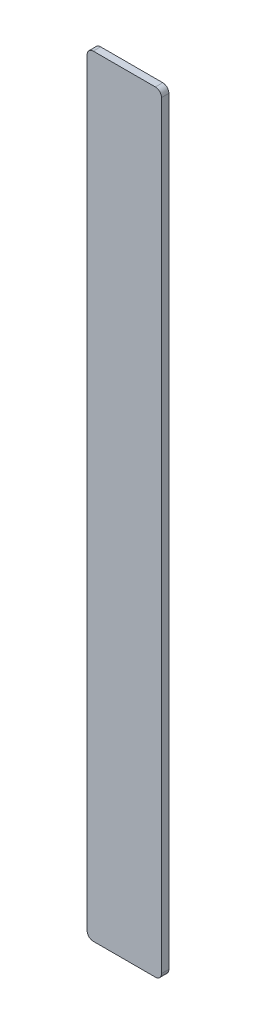
ISO-10303-21;
HEADER;
FILE_DESCRIPTION(('STEP AP214'),'2;1');
FILE_NAME('part.step','',(''),(''),'','','');
FILE_SCHEMA(('AUTOMOTIVE_DESIGN { 1 0 10303 214 1 1 1 1 }'));
ENDSEC;
DATA;
#1=APPLICATION_CONTEXT('core data for automotive mechanical design processes');
#2=APPLICATION_PROTOCOL_DEFINITION('international standard','automotive_design',2000,#1);
#3=PRODUCT_CONTEXT('',#1,'mechanical');
#4=PRODUCT('Part','Part','',(#3));
#5=PRODUCT_RELATED_PRODUCT_CATEGORY('part','',(#4));
#6=PRODUCT_DEFINITION_FORMATION('','',#4);
#7=PRODUCT_DEFINITION_CONTEXT('part definition',#1,'design');
#8=PRODUCT_DEFINITION('design','',#6,#7);
#9=PRODUCT_DEFINITION_SHAPE('','',#8);
#10=(LENGTH_UNIT() NAMED_UNIT(*) SI_UNIT(.MILLI.,.METRE.));
#11=(NAMED_UNIT(*) PLANE_ANGLE_UNIT() SI_UNIT($,.RADIAN.));
#12=(NAMED_UNIT(*) SI_UNIT($,.STERADIAN.) SOLID_ANGLE_UNIT());
#13=UNCERTAINTY_MEASURE_WITH_UNIT(LENGTH_MEASURE(1.E-05),#10,'distance_accuracy_value','');
#14=(GEOMETRIC_REPRESENTATION_CONTEXT(3) GLOBAL_UNCERTAINTY_ASSIGNED_CONTEXT((#13)) GLOBAL_UNIT_ASSIGNED_CONTEXT((#10,
#11,#12)) REPRESENTATION_CONTEXT('',''));
#15=CARTESIAN_POINT('',(0.,0.,0.));
#16=DIRECTION('',(0.,0.,1.));
#17=DIRECTION('',(1.,0.,0.));
#18=AXIS2_PLACEMENT_3D('',#15,#16,#17);
#19=CARTESIAN_POINT('',(-8.95983005625007,-22.7704584365744,331.960489148867));
#20=DIRECTION('',(0.,0.,-1.));
#21=DIRECTION('',(0.,-1.,0.));
#22=AXIS2_PLACEMENT_3D('',#19,#20,#21);
#23=PLANE('',#22);
#24=DIRECTION('',(1.,0.,0.));
#25=VECTOR('',#24,1.);
#26=CARTESIAN_POINT('',(-8.95983005625007,39.8358930212972,331.960489148867));
#27=LINE('',#26,#25);
#28=CARTESIAN_POINT('',(-14.0001602094953,39.8358930212972,331.960489148867));
#29=VERTEX_POINT('',#28);
#30=CARTESIAN_POINT('',(-3.91949990300487,39.8358930212972,331.960489148867));
#31=VERTEX_POINT('',#30);
#32=EDGE_CURVE('E178',#29,#31,#27,.T.);
#33=ORIENTED_EDGE('',*,*,#32,.T.);
#34=CARTESIAN_POINT('',(-3.91949990300487,38.8358930212972,331.960489148867));
#35=DIRECTION('',(0.,0.,1.));
#36=DIRECTION('',(-1.,0.,0.));
#37=AXIS2_PLACEMENT_3D('',#34,#35,#36);
#38=CIRCLE('',#37,1.);
#39=CARTESIAN_POINT('',(-2.91949990300487,38.8358930212972,331.960489148867));
#40=VERTEX_POINT('',#39);
#41=EDGE_CURVE('E53',#40,#31,#38,.T.);
#42=ORIENTED_EDGE('',*,*,#41,.F.);
#43=DIRECTION('',(0.,-1.,0.));
#44=VECTOR('',#43,1.);
#45=CARTESIAN_POINT('',(-2.91949990300488,-22.7704584365744,331.960489148867));
#46=LINE('',#45,#44);
#47=CARTESIAN_POINT('',(-2.91949990300488,-84.3768098944461,331.960489148867));
#48=VERTEX_POINT('',#47);
#49=EDGE_CURVE('E150',#40,#48,#46,.T.);
#50=ORIENTED_EDGE('',*,*,#49,.T.);
#51=CARTESIAN_POINT('',(-3.91949990300487,-84.3768098944461,331.960489148867));
#52=DIRECTION('',(0.,0.,1.));
#53=DIRECTION('',(-1.,0.,0.));
#54=AXIS2_PLACEMENT_3D('',#51,#52,#53);
#55=CIRCLE('',#54,1.);
#56=CARTESIAN_POINT('',(-3.91949990300487,-85.3768098944461,331.960489148867));
#57=VERTEX_POINT('',#56);
#58=EDGE_CURVE('E142',#57,#48,#55,.T.);
#59=ORIENTED_EDGE('',*,*,#58,.F.);
#60=DIRECTION('',(-1.,0.,0.));
#61=VECTOR('',#60,1.);
#62=CARTESIAN_POINT('',(-8.95983005625007,-85.3768098944461,331.960489148867));
#63=LINE('',#62,#61);
#64=CARTESIAN_POINT('',(-14.0001602094953,-85.3768098944461,331.960489148867));
#65=VERTEX_POINT('',#64);
#66=EDGE_CURVE('E96',#57,#65,#63,.T.);
#67=ORIENTED_EDGE('',*,*,#66,.T.);
#68=CARTESIAN_POINT('',(-14.0001602094953,-84.3768098944461,331.960489148867));
#69=DIRECTION('',(0.,0.,1.));
#70=DIRECTION('',(-1.,0.,0.));
#71=AXIS2_PLACEMENT_3D('',#68,#69,#70);
#72=CIRCLE('',#71,1.);
#73=CARTESIAN_POINT('',(-15.0001602094953,-84.3768098944461,331.960489148867));
#74=VERTEX_POINT('',#73);
#75=EDGE_CURVE('E123',#74,#65,#72,.T.);
#76=ORIENTED_EDGE('',*,*,#75,.F.);
#77=DIRECTION('',(0.,1.,0.));
#78=VECTOR('',#77,1.);
#79=CARTESIAN_POINT('',(-15.0001602094952,-22.7704584365744,331.960489148867));
#80=LINE('',#79,#78);
#81=CARTESIAN_POINT('',(-15.0001602094952,38.8358930212972,331.960489148867));
#82=VERTEX_POINT('',#81);
#83=EDGE_CURVE('E47',#74,#82,#80,.T.);
#84=ORIENTED_EDGE('',*,*,#83,.T.);
#85=CARTESIAN_POINT('',(-14.0001602094953,38.8358930212972,331.960489148867));
#86=DIRECTION('',(0.,0.,1.));
#87=DIRECTION('',(-1.,0.,0.));
#88=AXIS2_PLACEMENT_3D('',#85,#86,#87);
#89=CIRCLE('',#88,1.);
#90=EDGE_CURVE('E134',#29,#82,#89,.T.);
#91=ORIENTED_EDGE('',*,*,#90,.F.);
#92=EDGE_LOOP('',(#33,#42,#50,#59,#67,#76,#84,#91));
#93=FACE_BOUND('',#92,.T.);
#94=ADVANCED_FACE('F43',(#93),#23,.T.);
#95=CARTESIAN_POINT('',(2.66453525910038E-13,-50.9500000001419,333.160489148867));
#96=DIRECTION('',(0.,0.,1.));
#97=DIRECTION('',(1.,0.,0.));
#98=AXIS2_PLACEMENT_3D('',#95,#96,#97);
#99=PLANE('',#98);
#100=DIRECTION('',(1.,0.,0.));
#101=VECTOR('',#100,1.);
#102=CARTESIAN_POINT('',(2.66453525910038E-13,39.8358930212972,333.160489148867));
#103=LINE('',#102,#101);
#104=CARTESIAN_POINT('',(-14.0001602094953,39.8358930212972,333.160489148867));
#105=VERTEX_POINT('',#104);
#106=CARTESIAN_POINT('',(-3.91949990300487,39.8358930212972,333.160489148867));
#107=VERTEX_POINT('',#106);
#108=EDGE_CURVE('E128',#105,#107,#103,.T.);
#109=ORIENTED_EDGE('',*,*,#108,.F.);
#110=CARTESIAN_POINT('',(-14.0001602094953,38.8358930212972,333.160489148867));
#111=DIRECTION('',(0.,0.,1.));
#112=DIRECTION('',(1.,0.,0.));
#113=AXIS2_PLACEMENT_3D('',#110,#111,#112);
#114=CIRCLE('',#113,1.);
#115=CARTESIAN_POINT('',(-15.0001602094952,38.8358930212972,333.160489148867));
#116=VERTEX_POINT('',#115);
#117=EDGE_CURVE('E126',#105,#116,#114,.T.);
#118=ORIENTED_EDGE('',*,*,#117,.T.);
#119=DIRECTION('',(0.,1.,0.));
#120=VECTOR('',#119,1.);
#121=CARTESIAN_POINT('',(-15.0001602094952,-50.9500000001419,333.160489148867));
#122=LINE('',#121,#120);
#123=CARTESIAN_POINT('',(-15.0001602094953,-84.3768098944461,333.160489148867));
#124=VERTEX_POINT('',#123);
#125=EDGE_CURVE('E114',#124,#116,#122,.T.);
#126=ORIENTED_EDGE('',*,*,#125,.F.);
#127=CARTESIAN_POINT('',(-14.0001602094953,-84.3768098944461,333.160489148867));
#128=DIRECTION('',(0.,0.,1.));
#129=DIRECTION('',(1.,0.,0.));
#130=AXIS2_PLACEMENT_3D('',#127,#128,#129);
#131=CIRCLE('',#130,1.);
#132=CARTESIAN_POINT('',(-14.0001602094953,-85.3768098944461,333.160489148867));
#133=VERTEX_POINT('',#132);
#134=EDGE_CURVE('E104',#124,#133,#131,.T.);
#135=ORIENTED_EDGE('',*,*,#134,.T.);
#136=DIRECTION('',(-1.,0.,0.));
#137=VECTOR('',#136,1.);
#138=CARTESIAN_POINT('',(2.66453525910038E-13,-85.3768098944461,333.160489148867));
#139=LINE('',#138,#137);
#140=CARTESIAN_POINT('',(-3.91949990300487,-85.3768098944461,333.160489148867));
#141=VERTEX_POINT('',#140);
#142=EDGE_CURVE('E149',#141,#133,#139,.T.);
#143=ORIENTED_EDGE('',*,*,#142,.F.);
#144=CARTESIAN_POINT('',(-3.91949990300487,-84.3768098944461,333.160489148867));
#145=DIRECTION('',(0.,0.,1.));
#146=DIRECTION('',(1.,0.,0.));
#147=AXIS2_PLACEMENT_3D('',#144,#145,#146);
#148=CIRCLE('',#147,1.);
#149=CARTESIAN_POINT('',(-2.91949990300488,-84.3768098944461,333.160489148867));
#150=VERTEX_POINT('',#149);
#151=EDGE_CURVE('E153',#141,#150,#148,.T.);
#152=ORIENTED_EDGE('',*,*,#151,.T.);
#153=DIRECTION('',(0.,-1.,0.));
#154=VECTOR('',#153,1.);
#155=CARTESIAN_POINT('',(-2.91949990300488,-50.9500000001419,333.160489148867));
#156=LINE('',#155,#154);
#157=CARTESIAN_POINT('',(-2.91949990300487,38.8358930212972,333.160489148867));
#158=VERTEX_POINT('',#157);
#159=EDGE_CURVE('E157',#158,#150,#156,.T.);
#160=ORIENTED_EDGE('',*,*,#159,.F.);
#161=CARTESIAN_POINT('',(-3.91949990300487,38.8358930212972,333.160489148867));
#162=DIRECTION('',(0.,0.,1.));
#163=DIRECTION('',(1.,0.,0.));
#164=AXIS2_PLACEMENT_3D('',#161,#162,#163);
#165=CIRCLE('',#164,1.);
#166=EDGE_CURVE('E11',#158,#107,#165,.T.);
#167=ORIENTED_EDGE('',*,*,#166,.T.);
#168=EDGE_LOOP('',(#109,#118,#126,#135,#143,#152,#160,#167));
#169=FACE_BOUND('',#168,.T.);
#170=ADVANCED_FACE('F45',(#169),#99,.T.);
#171=CARTESIAN_POINT('',(-3.91949990300487,38.8358930212972,364.060489148867));
#172=DIRECTION('',(0.,0.,-1.));
#173=DIRECTION('',(-1.,0.,0.));
#174=AXIS2_PLACEMENT_3D('',#171,#172,#173);
#175=CYLINDRICAL_SURFACE('',#174,1.);
#176=ORIENTED_EDGE('',*,*,#41,.T.);
#177=CARTESIAN_POINT('',(-3.91949990300487,39.8358930212972,333.160489148867));
#178=CARTESIAN_POINT('',(-3.91949990300487,39.8358930212972,332.760489148867));
#179=CARTESIAN_POINT('',(-3.91949990300487,39.8358930212972,332.360489148867));
#180=CARTESIAN_POINT('',(-3.91949990300487,39.8358930212972,331.960489148867));
#181=(BOUNDED_CURVE() B_SPLINE_CURVE(3,(#177,#178,#179,#180),.UNSPECIFIED.,.F.,
.F.) B_SPLINE_CURVE_WITH_KNOTS((4,4),(0.,1.),
.UNSPECIFIED.) CURVE() GEOMETRIC_REPRESENTATION_ITEM() RATIONAL_B_SPLINE_CURVE((1.,1.,1.,1.)) REPRESENTATION_ITEM(''));
#182=EDGE_CURVE('E136',#107,#31,#181,.T.);
#183=ORIENTED_EDGE('',*,*,#182,.F.);
#184=ORIENTED_EDGE('',*,*,#166,.F.);
#185=CARTESIAN_POINT('',(-2.91949990300487,38.8358930212972,333.160489148867));
#186=CARTESIAN_POINT('',(-2.91949990300487,38.8358930212972,332.760489148867));
#187=CARTESIAN_POINT('',(-2.91949990300487,38.8358930212972,332.360489148867));
#188=CARTESIAN_POINT('',(-2.91949990300487,38.8358930212972,331.960489148867));
#189=(BOUNDED_CURVE() B_SPLINE_CURVE(3,(#185,#186,#187,#188),.UNSPECIFIED.,.F.,
.F.) B_SPLINE_CURVE_WITH_KNOTS((4,4),(0.,1.),
.UNSPECIFIED.) CURVE() GEOMETRIC_REPRESENTATION_ITEM() RATIONAL_B_SPLINE_CURVE((1.,1.,1.,1.)) REPRESENTATION_ITEM(''));
#190=EDGE_CURVE('E152',#158,#40,#189,.T.);
#191=ORIENTED_EDGE('',*,*,#190,.T.);
#192=EDGE_LOOP('',(#176,#183,#184,#191));
#193=FACE_BOUND('',#192,.T.);
#194=ADVANCED_FACE('F197',(#193),#175,.T.);
#195=CARTESIAN_POINT('',(-2.91949990300488,-22.7704584365744,364.060489148867));
#196=DIRECTION('',(1.,0.,0.));
#197=DIRECTION('',(0.,1.,0.));
#198=AXIS2_PLACEMENT_3D('',#195,#196,#197);
#199=PLANE('',#198);
#200=ORIENTED_EDGE('',*,*,#49,.F.);
#201=ORIENTED_EDGE('',*,*,#190,.F.);
#202=ORIENTED_EDGE('',*,*,#159,.T.);
#203=CARTESIAN_POINT('',(-2.91949990300488,-84.3768098944461,333.160489148867));
#204=CARTESIAN_POINT('',(-2.91949990300488,-84.3768098944461,332.760489148867));
#205=CARTESIAN_POINT('',(-2.91949990300488,-84.3768098944461,332.360489148867));
#206=CARTESIAN_POINT('',(-2.91949990300488,-84.3768098944461,331.960489148867));
#207=(BOUNDED_CURVE() B_SPLINE_CURVE(3,(#203,#204,#205,#206),.UNSPECIFIED.,.F.,
.F.) B_SPLINE_CURVE_WITH_KNOTS((4,4),(0.,1.),
.UNSPECIFIED.) CURVE() GEOMETRIC_REPRESENTATION_ITEM() RATIONAL_B_SPLINE_CURVE((1.,1.,1.,1.)) REPRESENTATION_ITEM(''));
#208=EDGE_CURVE('E148',#150,#48,#207,.T.);
#209=ORIENTED_EDGE('',*,*,#208,.T.);
#210=EDGE_LOOP('',(#200,#201,#202,#209));
#211=FACE_BOUND('',#210,.T.);
#212=ADVANCED_FACE('F237',(#211),#199,.T.);
#213=CARTESIAN_POINT('',(-3.91949990300487,-84.3768098944461,364.060489148867));
#214=DIRECTION('',(0.,0.,-1.));
#215=DIRECTION('',(-1.,0.,0.));
#216=AXIS2_PLACEMENT_3D('',#213,#214,#215);
#217=CYLINDRICAL_SURFACE('',#216,1.);
#218=ORIENTED_EDGE('',*,*,#58,.T.);
#219=ORIENTED_EDGE('',*,*,#208,.F.);
#220=ORIENTED_EDGE('',*,*,#151,.F.);
#221=CARTESIAN_POINT('',(-3.91949990300487,-85.3768098944461,333.160489148867));
#222=CARTESIAN_POINT('',(-3.91949990300487,-85.3768098944461,332.760489148867));
#223=CARTESIAN_POINT('',(-3.91949990300487,-85.3768098944461,332.360489148867));
#224=CARTESIAN_POINT('',(-3.91949990300487,-85.3768098944461,331.960489148867));
#225=(BOUNDED_CURVE() B_SPLINE_CURVE(3,(#221,#222,#223,#224),.UNSPECIFIED.,.F.,
.F.) B_SPLINE_CURVE_WITH_KNOTS((4,4),(0.,1.),
.UNSPECIFIED.) CURVE() GEOMETRIC_REPRESENTATION_ITEM() RATIONAL_B_SPLINE_CURVE((1.,1.,1.,1.)) REPRESENTATION_ITEM(''));
#226=EDGE_CURVE('E182',#141,#57,#225,.T.);
#227=ORIENTED_EDGE('',*,*,#226,.T.);
#228=EDGE_LOOP('',(#218,#219,#220,#227));
#229=FACE_BOUND('',#228,.T.);
#230=ADVANCED_FACE('F229',(#229),#217,.T.);
#231=CARTESIAN_POINT('',(-8.95983005625007,-85.3768098944461,364.060489148867));
#232=DIRECTION('',(0.,-1.,0.));
#233=DIRECTION('',(0.,0.,-1.));
#234=AXIS2_PLACEMENT_3D('',#231,#232,#233);
#235=PLANE('',#234);
#236=ORIENTED_EDGE('',*,*,#66,.F.);
#237=ORIENTED_EDGE('',*,*,#226,.F.);
#238=ORIENTED_EDGE('',*,*,#142,.T.);
#239=CARTESIAN_POINT('',(-14.0001602094953,-85.3768098944461,333.160489148867));
#240=CARTESIAN_POINT('',(-14.0001602094953,-85.3768098944461,332.760489148867));
#241=CARTESIAN_POINT('',(-14.0001602094953,-85.3768098944461,332.360489148867));
#242=CARTESIAN_POINT('',(-14.0001602094953,-85.3768098944461,331.960489148867));
#243=(BOUNDED_CURVE() B_SPLINE_CURVE(3,(#239,#240,#241,#242),.UNSPECIFIED.,.F.,
.F.) B_SPLINE_CURVE_WITH_KNOTS((4,4),(0.,1.),
.UNSPECIFIED.) CURVE() GEOMETRIC_REPRESENTATION_ITEM() RATIONAL_B_SPLINE_CURVE((1.,1.,1.,1.)) REPRESENTATION_ITEM(''));
#244=EDGE_CURVE('E162',#133,#65,#243,.T.);
#245=ORIENTED_EDGE('',*,*,#244,.T.);
#246=EDGE_LOOP('',(#236,#237,#238,#245));
#247=FACE_BOUND('',#246,.T.);
#248=ADVANCED_FACE('F227',(#247),#235,.T.);
#249=CARTESIAN_POINT('',(-14.0001602094953,-84.3768098944461,364.060489148867));
#250=DIRECTION('',(0.,0.,-1.));
#251=DIRECTION('',(-1.,0.,0.));
#252=AXIS2_PLACEMENT_3D('',#249,#250,#251);
#253=CYLINDRICAL_SURFACE('',#252,1.);
#254=ORIENTED_EDGE('',*,*,#75,.T.);
#255=ORIENTED_EDGE('',*,*,#244,.F.);
#256=ORIENTED_EDGE('',*,*,#134,.F.);
#257=CARTESIAN_POINT('',(-15.0001602094953,-84.3768098944461,333.160489148867));
#258=CARTESIAN_POINT('',(-15.0001602094953,-84.3768098944461,332.760489148867));
#259=CARTESIAN_POINT('',(-15.0001602094953,-84.3768098944461,332.360489148867));
#260=CARTESIAN_POINT('',(-15.0001602094953,-84.3768098944461,331.960489148867));
#261=(BOUNDED_CURVE() B_SPLINE_CURVE(3,(#257,#258,#259,#260),.UNSPECIFIED.,.F.,
.F.) B_SPLINE_CURVE_WITH_KNOTS((4,4),(0.,1.),
.UNSPECIFIED.) CURVE() GEOMETRIC_REPRESENTATION_ITEM() RATIONAL_B_SPLINE_CURVE((1.,1.,1.,1.)) REPRESENTATION_ITEM(''));
#262=EDGE_CURVE('E121',#124,#74,#261,.T.);
#263=ORIENTED_EDGE('',*,*,#262,.T.);
#264=EDGE_LOOP('',(#254,#255,#256,#263));
#265=FACE_BOUND('',#264,.T.);
#266=ADVANCED_FACE('F225',(#265),#253,.T.);
#267=CARTESIAN_POINT('',(-15.0001602094952,-22.7704584365744,364.060489148867));
#268=DIRECTION('',(-1.,0.,0.));
#269=DIRECTION('',(0.,0.,1.));
#270=AXIS2_PLACEMENT_3D('',#267,#268,#269);
#271=PLANE('',#270);
#272=ORIENTED_EDGE('',*,*,#83,.F.);
#273=ORIENTED_EDGE('',*,*,#262,.F.);
#274=ORIENTED_EDGE('',*,*,#125,.T.);
#275=CARTESIAN_POINT('',(-15.0001602094952,38.8358930212972,333.160489148867));
#276=CARTESIAN_POINT('',(-15.0001602094952,38.8358930212972,332.760489148867));
#277=CARTESIAN_POINT('',(-15.0001602094952,38.8358930212972,332.360489148867));
#278=CARTESIAN_POINT('',(-15.0001602094952,38.8358930212972,331.960489148867));
#279=(BOUNDED_CURVE() B_SPLINE_CURVE(3,(#275,#276,#277,#278),.UNSPECIFIED.,.F.,
.F.) B_SPLINE_CURVE_WITH_KNOTS((4,4),(0.,1.),
.UNSPECIFIED.) CURVE() GEOMETRIC_REPRESENTATION_ITEM() RATIONAL_B_SPLINE_CURVE((1.,1.,1.,1.)) REPRESENTATION_ITEM(''));
#280=EDGE_CURVE('E119',#116,#82,#279,.T.);
#281=ORIENTED_EDGE('',*,*,#280,.T.);
#282=EDGE_LOOP('',(#272,#273,#274,#281));
#283=FACE_BOUND('',#282,.T.);
#284=ADVANCED_FACE('F117',(#283),#271,.T.);
#285=CARTESIAN_POINT('',(-14.0001602094953,38.8358930212972,364.060489148867));
#286=DIRECTION('',(0.,0.,-1.));
#287=DIRECTION('',(-1.,0.,0.));
#288=AXIS2_PLACEMENT_3D('',#285,#286,#287);
#289=CYLINDRICAL_SURFACE('',#288,1.);
#290=ORIENTED_EDGE('',*,*,#90,.T.);
#291=ORIENTED_EDGE('',*,*,#280,.F.);
#292=ORIENTED_EDGE('',*,*,#117,.F.);
#293=CARTESIAN_POINT('',(-14.0001602094953,39.8358930212972,333.160489148867));
#294=CARTESIAN_POINT('',(-14.0001602094953,39.8358930212972,332.760489148867));
#295=CARTESIAN_POINT('',(-14.0001602094953,39.8358930212972,332.360489148867));
#296=CARTESIAN_POINT('',(-14.0001602094953,39.8358930212972,331.960489148867));
#297=(BOUNDED_CURVE() B_SPLINE_CURVE(3,(#293,#294,#295,#296),.UNSPECIFIED.,.F.,
.F.) B_SPLINE_CURVE_WITH_KNOTS((4,4),(0.,1.),
.UNSPECIFIED.) CURVE() GEOMETRIC_REPRESENTATION_ITEM() RATIONAL_B_SPLINE_CURVE((1.,1.,1.,1.)) REPRESENTATION_ITEM(''));
#298=EDGE_CURVE('E181',#105,#29,#297,.T.);
#299=ORIENTED_EDGE('',*,*,#298,.T.);
#300=EDGE_LOOP('',(#290,#291,#292,#299));
#301=FACE_BOUND('',#300,.T.);
#302=ADVANCED_FACE('F133',(#301),#289,.T.);
#303=CARTESIAN_POINT('',(-8.95983005625007,39.8358930212972,364.060489148867));
#304=DIRECTION('',(0.,1.,0.));
#305=DIRECTION('',(1.,0.,0.));
#306=AXIS2_PLACEMENT_3D('',#303,#304,#305);
#307=PLANE('',#306);
#308=ORIENTED_EDGE('',*,*,#32,.F.);
#309=ORIENTED_EDGE('',*,*,#298,.F.);
#310=ORIENTED_EDGE('',*,*,#108,.T.);
#311=ORIENTED_EDGE('',*,*,#182,.T.);
#312=EDGE_LOOP('',(#308,#309,#310,#311));
#313=FACE_BOUND('',#312,.T.);
#314=ADVANCED_FACE('F200',(#313),#307,.T.);
#315=CLOSED_SHELL('',(#94,#170,#194,#212,#230,#248,#266,#284,#302,#314));
#316=MANIFOLD_SOLID_BREP('B2',#315);
#317=ADVANCED_BREP_SHAPE_REPRESENTATION('',(#18,#316),#14);
#318=SHAPE_DEFINITION_REPRESENTATION(#9,#317);
ENDSEC;
END-ISO-10303-21;
